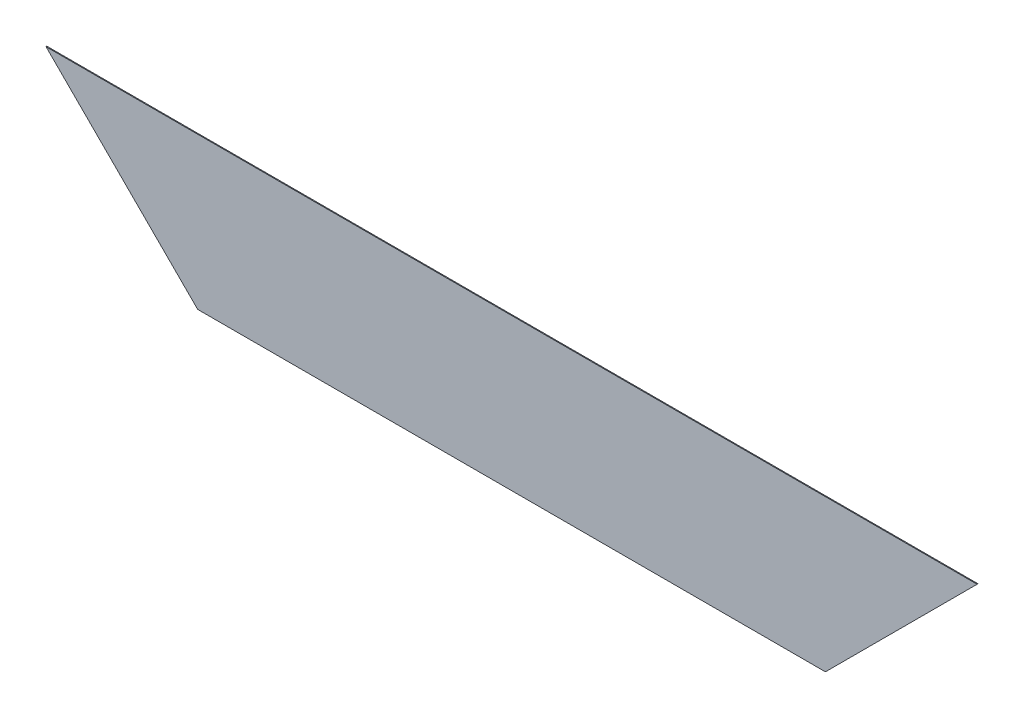
ISO-10303-21;
HEADER;
FILE_DESCRIPTION(('STEP AP214'),'2;1');
FILE_NAME('part.step','',(''),(''),'','','');
FILE_SCHEMA(('AUTOMOTIVE_DESIGN { 1 0 10303 214 1 1 1 1 }'));
ENDSEC;
DATA;
#1=APPLICATION_CONTEXT('core data for automotive mechanical design processes');
#2=APPLICATION_PROTOCOL_DEFINITION('international standard','automotive_design',2000,#1);
#3=PRODUCT_CONTEXT('',#1,'mechanical');
#4=PRODUCT('Part','Part','',(#3));
#5=PRODUCT_RELATED_PRODUCT_CATEGORY('part','',(#4));
#6=PRODUCT_DEFINITION_FORMATION('','',#4);
#7=PRODUCT_DEFINITION_CONTEXT('part definition',#1,'design');
#8=PRODUCT_DEFINITION('design','',#6,#7);
#9=PRODUCT_DEFINITION_SHAPE('','',#8);
#10=(LENGTH_UNIT() NAMED_UNIT(*) SI_UNIT(.MILLI.,.METRE.));
#11=(NAMED_UNIT(*) PLANE_ANGLE_UNIT() SI_UNIT($,.RADIAN.));
#12=(NAMED_UNIT(*) SI_UNIT($,.STERADIAN.) SOLID_ANGLE_UNIT());
#13=UNCERTAINTY_MEASURE_WITH_UNIT(LENGTH_MEASURE(1.E-05),#10,'distance_accuracy_value','');
#14=(GEOMETRIC_REPRESENTATION_CONTEXT(3) GLOBAL_UNCERTAINTY_ASSIGNED_CONTEXT((#13)) GLOBAL_UNIT_ASSIGNED_CONTEXT((#10,
#11,#12)) REPRESENTATION_CONTEXT('',''));
#15=CARTESIAN_POINT('',(0.,0.,0.));
#16=DIRECTION('',(0.,0.,1.));
#17=DIRECTION('',(1.,0.,0.));
#18=AXIS2_PLACEMENT_3D('',#15,#16,#17);
#19=CARTESIAN_POINT('',(-13.35,2.175,0.025));
#20=DIRECTION('',(0.,-1.,0.));
#21=DIRECTION('',(0.,0.,-1.));
#22=AXIS2_PLACEMENT_3D('',#19,#20,#21);
#23=PLANE('',#22);
#24=DIRECTION('',(-1.,0.,0.));
#25=VECTOR('',#24,1.);
#26=CARTESIAN_POINT('',(-13.35,2.175,0.));
#27=LINE('',#26,#25);
#28=CARTESIAN_POINT('',(13.35,2.175,0.));
#29=VERTEX_POINT('',#28);
#30=CARTESIAN_POINT('',(-13.35,2.175,0.));
#31=VERTEX_POINT('',#30);
#32=EDGE_CURVE('E96',#29,#31,#27,.T.);
#33=ORIENTED_EDGE('',*,*,#32,.T.);
#34=DIRECTION('',(0.,0.,-1.));
#35=VECTOR('',#34,1.);
#36=CARTESIAN_POINT('',(-13.35,2.175,0.025));
#37=LINE('',#36,#35);
#38=CARTESIAN_POINT('',(-13.35,2.175,0.025));
#39=VERTEX_POINT('',#38);
#40=EDGE_CURVE('E11',#39,#31,#37,.T.);
#41=ORIENTED_EDGE('',*,*,#40,.F.);
#42=DIRECTION('',(-1.,0.,0.));
#43=VECTOR('',#42,1.);
#44=CARTESIAN_POINT('',(-13.35,2.175,0.025));
#45=LINE('',#44,#43);
#46=CARTESIAN_POINT('',(13.35,2.175,0.025));
#47=VERTEX_POINT('',#46);
#48=EDGE_CURVE('E84',#47,#39,#45,.T.);
#49=ORIENTED_EDGE('',*,*,#48,.F.);
#50=DIRECTION('',(0.,0.,-1.));
#51=VECTOR('',#50,1.);
#52=CARTESIAN_POINT('',(13.35,2.175,0.025));
#53=LINE('',#52,#51);
#54=EDGE_CURVE('E92',#47,#29,#53,.T.);
#55=ORIENTED_EDGE('',*,*,#54,.T.);
#56=EDGE_LOOP('',(#33,#41,#49,#55));
#57=FACE_BOUND('',#56,.T.);
#58=ADVANCED_FACE('F33',(#57),#23,.F.);
#59=CARTESIAN_POINT('',(-13.35,2.175,0.025));
#60=DIRECTION('',(0.707106781186549,0.707106781186546,0.));
#61=DIRECTION('',(-0.707106781186546,0.707106781186549,0.));
#62=AXIS2_PLACEMENT_3D('',#59,#60,#61);
#63=PLANE('',#62);
#64=DIRECTION('',(0.707106781186546,-0.707106781186549,0.));
#65=VECTOR('',#64,1.);
#66=CARTESIAN_POINT('',(-13.35,2.175,0.));
#67=LINE('',#66,#65);
#68=CARTESIAN_POINT('',(-9.00000000000002,-2.175,0.));
#69=VERTEX_POINT('',#68);
#70=EDGE_CURVE('E88',#31,#69,#67,.T.);
#71=ORIENTED_EDGE('',*,*,#70,.T.);
#72=DIRECTION('',(0.,0.,-1.));
#73=VECTOR('',#72,1.);
#74=CARTESIAN_POINT('',(-9.00000000000002,-2.175,0.025));
#75=LINE('',#74,#73);
#76=CARTESIAN_POINT('',(-9.00000000000002,-2.175,0.025));
#77=VERTEX_POINT('',#76);
#78=EDGE_CURVE('E41',#77,#69,#75,.T.);
#79=ORIENTED_EDGE('',*,*,#78,.F.);
#80=DIRECTION('',(0.707106781186546,-0.707106781186549,0.));
#81=VECTOR('',#80,1.);
#82=CARTESIAN_POINT('',(-13.35,2.175,0.025));
#83=LINE('',#82,#81);
#84=EDGE_CURVE('E79',#39,#77,#83,.T.);
#85=ORIENTED_EDGE('',*,*,#84,.F.);
#86=ORIENTED_EDGE('',*,*,#40,.T.);
#87=EDGE_LOOP('',(#71,#79,#85,#86));
#88=FACE_BOUND('',#87,.T.);
#89=ADVANCED_FACE('F87',(#88),#63,.F.);
#90=CARTESIAN_POINT('',(-9.00000000000002,-2.175,0.025));
#91=DIRECTION('',(0.,1.,0.));
#92=DIRECTION('',(0.,0.,1.));
#93=AXIS2_PLACEMENT_3D('',#90,#91,#92);
#94=PLANE('',#93);
#95=DIRECTION('',(1.,0.,0.));
#96=VECTOR('',#95,1.);
#97=CARTESIAN_POINT('',(-9.00000000000002,-2.175,0.));
#98=LINE('',#97,#96);
#99=CARTESIAN_POINT('',(9.00000000000002,-2.175,0.));
#100=VERTEX_POINT('',#99);
#101=EDGE_CURVE('E66',#69,#100,#98,.T.);
#102=ORIENTED_EDGE('',*,*,#101,.T.);
#103=DIRECTION('',(0.,0.,-1.));
#104=VECTOR('',#103,1.);
#105=CARTESIAN_POINT('',(9.00000000000002,-2.175,0.025));
#106=LINE('',#105,#104);
#107=CARTESIAN_POINT('',(9.00000000000002,-2.175,0.025));
#108=VERTEX_POINT('',#107);
#109=EDGE_CURVE('E89',#108,#100,#106,.T.);
#110=ORIENTED_EDGE('',*,*,#109,.F.);
#111=DIRECTION('',(1.,0.,0.));
#112=VECTOR('',#111,1.);
#113=CARTESIAN_POINT('',(-9.00000000000002,-2.175,0.025));
#114=LINE('',#113,#112);
#115=EDGE_CURVE('E82',#77,#108,#114,.T.);
#116=ORIENTED_EDGE('',*,*,#115,.F.);
#117=ORIENTED_EDGE('',*,*,#78,.T.);
#118=EDGE_LOOP('',(#102,#110,#116,#117));
#119=FACE_BOUND('',#118,.T.);
#120=ADVANCED_FACE('F90',(#119),#94,.F.);
#121=CARTESIAN_POINT('',(13.35,2.175,0.025));
#122=DIRECTION('',(-0.70710678118655,0.707106781186545,0.));
#123=DIRECTION('',(-0.707106781186545,-0.70710678118655,0.));
#124=AXIS2_PLACEMENT_3D('',#121,#122,#123);
#125=PLANE('',#124);
#126=DIRECTION('',(0.707106781186545,0.70710678118655,0.));
#127=VECTOR('',#126,1.);
#128=CARTESIAN_POINT('',(13.35,2.175,0.));
#129=LINE('',#128,#127);
#130=EDGE_CURVE('E72',#100,#29,#129,.T.);
#131=ORIENTED_EDGE('',*,*,#130,.T.);
#132=ORIENTED_EDGE('',*,*,#54,.F.);
#133=DIRECTION('',(0.707106781186545,0.70710678118655,0.));
#134=VECTOR('',#133,1.);
#135=CARTESIAN_POINT('',(13.35,2.175,0.025));
#136=LINE('',#135,#134);
#137=EDGE_CURVE('E49',#108,#47,#136,.T.);
#138=ORIENTED_EDGE('',*,*,#137,.F.);
#139=ORIENTED_EDGE('',*,*,#109,.T.);
#140=EDGE_LOOP('',(#131,#132,#138,#139));
#141=FACE_BOUND('',#140,.T.);
#142=ADVANCED_FACE('F103',(#141),#125,.F.);
#143=CARTESIAN_POINT('',(0.,0.,0.025));
#144=DIRECTION('',(0.,0.,-1.));
#145=DIRECTION('',(-1.,0.,0.));
#146=AXIS2_PLACEMENT_3D('',#143,#144,#145);
#147=PLANE('',#146);
#148=ORIENTED_EDGE('',*,*,#48,.T.);
#149=ORIENTED_EDGE('',*,*,#84,.T.);
#150=ORIENTED_EDGE('',*,*,#115,.T.);
#151=ORIENTED_EDGE('',*,*,#137,.T.);
#152=EDGE_LOOP('',(#148,#149,#150,#151));
#153=FACE_BOUND('',#152,.T.);
#154=ADVANCED_FACE('F80',(#153),#147,.F.);
#155=CARTESIAN_POINT('',(0.,0.,0.));
#156=DIRECTION('',(0.,0.,-1.));
#157=DIRECTION('',(-1.,0.,0.));
#158=AXIS2_PLACEMENT_3D('',#155,#156,#157);
#159=PLANE('',#158);
#160=ORIENTED_EDGE('',*,*,#32,.F.);
#161=ORIENTED_EDGE('',*,*,#130,.F.);
#162=ORIENTED_EDGE('',*,*,#101,.F.);
#163=ORIENTED_EDGE('',*,*,#70,.F.);
#164=EDGE_LOOP('',(#160,#161,#162,#163));
#165=FACE_BOUND('',#164,.T.);
#166=ADVANCED_FACE('F106',(#165),#159,.T.);
#167=CLOSED_SHELL('',(#58,#89,#120,#142,#154,#166));
#168=MANIFOLD_SOLID_BREP('B2',#167);
#169=ADVANCED_BREP_SHAPE_REPRESENTATION('',(#18,#168),#14);
#170=SHAPE_DEFINITION_REPRESENTATION(#9,#169);
ENDSEC;
END-ISO-10303-21;
